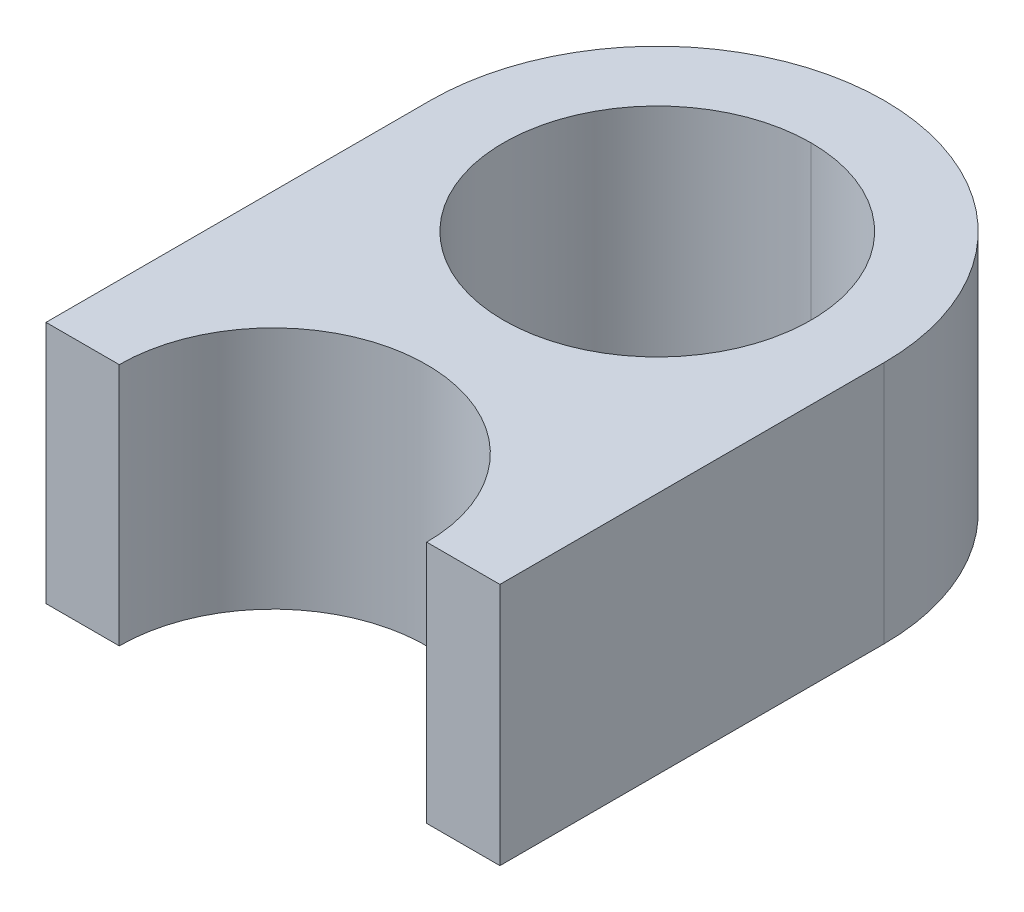
ISO-10303-21;
HEADER;
FILE_DESCRIPTION(('STEP AP214'),'2;1');
FILE_NAME('part.step','',(''),(''),'','','');
FILE_SCHEMA(('AUTOMOTIVE_DESIGN { 1 0 10303 214 1 1 1 1 }'));
ENDSEC;
DATA;
#1=APPLICATION_CONTEXT('core data for automotive mechanical design processes');
#2=APPLICATION_PROTOCOL_DEFINITION('international standard','automotive_design',2000,#1);
#3=PRODUCT_CONTEXT('',#1,'mechanical');
#4=PRODUCT('Part','Part','',(#3));
#5=PRODUCT_RELATED_PRODUCT_CATEGORY('part','',(#4));
#6=PRODUCT_DEFINITION_FORMATION('','',#4);
#7=PRODUCT_DEFINITION_CONTEXT('part definition',#1,'design');
#8=PRODUCT_DEFINITION('design','',#6,#7);
#9=PRODUCT_DEFINITION_SHAPE('','',#8);
#10=(LENGTH_UNIT() NAMED_UNIT(*) SI_UNIT(.MILLI.,.METRE.));
#11=(NAMED_UNIT(*) PLANE_ANGLE_UNIT() SI_UNIT($,.RADIAN.));
#12=(NAMED_UNIT(*) SI_UNIT($,.STERADIAN.) SOLID_ANGLE_UNIT());
#13=UNCERTAINTY_MEASURE_WITH_UNIT(LENGTH_MEASURE(1.E-05),#10,'distance_accuracy_value','');
#14=(GEOMETRIC_REPRESENTATION_CONTEXT(3) GLOBAL_UNCERTAINTY_ASSIGNED_CONTEXT((#13)) GLOBAL_UNIT_ASSIGNED_CONTEXT((#10,
#11,#12)) REPRESENTATION_CONTEXT('',''));
#15=CARTESIAN_POINT('',(0.,0.,0.));
#16=DIRECTION('',(0.,0.,1.));
#17=DIRECTION('',(1.,0.,0.));
#18=AXIS2_PLACEMENT_3D('',#15,#16,#17);
#19=CARTESIAN_POINT('',(-17.78,2.5,7.62));
#20=DIRECTION('',(0.,1.,0.));
#21=DIRECTION('',(0.,0.,1.));
#22=AXIS2_PLACEMENT_3D('',#19,#20,#21);
#23=CYLINDRICAL_SURFACE('',#22,0.508);
#24=CARTESIAN_POINT('',(-17.78,2.5,7.62));
#25=DIRECTION('',(0.,1.,0.));
#26=DIRECTION('',(0.,0.,1.));
#27=AXIS2_PLACEMENT_3D('',#24,#25,#26);
#28=CIRCLE('',#27,0.508);
#29=CARTESIAN_POINT('',(-17.78,2.5,7.112));
#30=VERTEX_POINT('',#29);
#31=CARTESIAN_POINT('',(-17.78,2.5,8.128));
#32=VERTEX_POINT('',#31);
#33=EDGE_CURVE('E11',#30,#32,#28,.T.);
#34=ORIENTED_EDGE('',*,*,#33,.F.);
#35=DIRECTION('',(0.,1.,0.));
#36=VECTOR('',#35,1.);
#37=CARTESIAN_POINT('',(-17.78,2.5,7.112));
#38=LINE('',#37,#36);
#39=CARTESIAN_POINT('',(-17.78,3.305,7.112));
#40=VERTEX_POINT('',#39);
#41=EDGE_CURVE('E24',#30,#40,#38,.T.);
#42=ORIENTED_EDGE('',*,*,#41,.T.);
#43=CARTESIAN_POINT('',(-17.78,3.305,7.62));
#44=DIRECTION('',(0.,-1.,0.));
#45=DIRECTION('',(0.,0.,1.));
#46=AXIS2_PLACEMENT_3D('',#43,#44,#45);
#47=CIRCLE('',#46,0.508);
#48=CARTESIAN_POINT('',(-17.78,3.305,8.128));
#49=VERTEX_POINT('',#48);
#50=EDGE_CURVE('E147',#49,#40,#47,.T.);
#51=ORIENTED_EDGE('',*,*,#50,.F.);
#52=DIRECTION('',(0.,1.,0.));
#53=VECTOR('',#52,1.);
#54=CARTESIAN_POINT('',(-17.78,2.5,8.128));
#55=LINE('',#54,#53);
#56=EDGE_CURVE('E37',#32,#49,#55,.T.);
#57=ORIENTED_EDGE('',*,*,#56,.F.);
#58=EDGE_LOOP('',(#34,#42,#51,#57));
#59=FACE_BOUND('',#58,.T.);
#60=ADVANCED_FACE('F17',(#59),#23,.F.);
#61=CARTESIAN_POINT('',(-17.78,2.5,7.62));
#62=DIRECTION('',(0.,1.,0.));
#63=DIRECTION('',(0.,0.,1.));
#64=AXIS2_PLACEMENT_3D('',#61,#62,#63);
#65=CYLINDRICAL_SURFACE('',#64,0.508);
#66=ORIENTED_EDGE('',*,*,#41,.F.);
#67=CARTESIAN_POINT('',(-17.78,2.5,7.62));
#68=DIRECTION('',(0.,1.,0.));
#69=DIRECTION('',(0.,0.,1.));
#70=AXIS2_PLACEMENT_3D('',#67,#68,#69);
#71=CIRCLE('',#70,0.508);
#72=EDGE_CURVE('E143',#32,#30,#71,.T.);
#73=ORIENTED_EDGE('',*,*,#72,.F.);
#74=ORIENTED_EDGE('',*,*,#56,.T.);
#75=CARTESIAN_POINT('',(-17.78,3.305,7.62));
#76=DIRECTION('',(0.,-1.,0.));
#77=DIRECTION('',(0.,0.,1.));
#78=AXIS2_PLACEMENT_3D('',#75,#76,#77);
#79=CIRCLE('',#78,0.508);
#80=EDGE_CURVE('E140',#40,#49,#79,.T.);
#81=ORIENTED_EDGE('',*,*,#80,.F.);
#82=EDGE_LOOP('',(#66,#73,#74,#81));
#83=FACE_BOUND('',#82,.T.);
#84=ADVANCED_FACE('F148',(#83),#65,.F.);
#85=CARTESIAN_POINT('',(-17.78,3.305,7.62));
#86=DIRECTION('',(0.,-1.,0.));
#87=DIRECTION('',(0.,0.,-1.));
#88=AXIS2_PLACEMENT_3D('',#85,#86,#87);
#89=PLANE('',#88);
#90=DIRECTION('',(0.,0.,-1.));
#91=VECTOR('',#90,1.);
#92=CARTESIAN_POINT('',(-18.53,3.305,7.62));
#93=LINE('',#92,#91);
#94=CARTESIAN_POINT('',(-18.53,3.305,8.89));
#95=VERTEX_POINT('',#94);
#96=CARTESIAN_POINT('',(-18.53,3.305,7.62));
#97=VERTEX_POINT('',#96);
#98=EDGE_CURVE('E138',#95,#97,#93,.T.);
#99=ORIENTED_EDGE('',*,*,#98,.F.);
#100=DIRECTION('',(-1.,0.,0.));
#101=VECTOR('',#100,1.);
#102=CARTESIAN_POINT('',(-17.78,3.305,8.89));
#103=LINE('',#102,#101);
#104=CARTESIAN_POINT('',(-18.288,3.305,8.89));
#105=VERTEX_POINT('',#104);
#106=EDGE_CURVE('E135',#105,#95,#103,.T.);
#107=ORIENTED_EDGE('',*,*,#106,.F.);
#108=CARTESIAN_POINT('',(-17.78,3.305,8.89));
#109=DIRECTION('',(0.,1.,0.));
#110=DIRECTION('',(0.,0.,1.));
#111=AXIS2_PLACEMENT_3D('',#108,#109,#110);
#112=CIRCLE('',#111,0.508);
#113=CARTESIAN_POINT('',(-17.272,3.305,8.89));
#114=VERTEX_POINT('',#113);
#115=EDGE_CURVE('E133',#114,#105,#112,.T.);
#116=ORIENTED_EDGE('',*,*,#115,.F.);
#117=DIRECTION('',(-1.,0.,0.));
#118=VECTOR('',#117,1.);
#119=CARTESIAN_POINT('',(-17.78,3.305,8.89));
#120=LINE('',#119,#118);
#121=CARTESIAN_POINT('',(-17.03,3.305,8.89));
#122=VERTEX_POINT('',#121);
#123=EDGE_CURVE('E105',#122,#114,#120,.T.);
#124=ORIENTED_EDGE('',*,*,#123,.F.);
#125=DIRECTION('',(0.,0.,1.));
#126=VECTOR('',#125,1.);
#127=CARTESIAN_POINT('',(-17.03,3.305,7.62));
#128=LINE('',#127,#126);
#129=CARTESIAN_POINT('',(-17.03,3.305,7.62));
#130=VERTEX_POINT('',#129);
#131=EDGE_CURVE('E129',#130,#122,#128,.T.);
#132=ORIENTED_EDGE('',*,*,#131,.F.);
#133=CARTESIAN_POINT('',(-17.78,3.305,7.62));
#134=DIRECTION('',(0.,-1.,0.));
#135=DIRECTION('',(0.,0.,1.));
#136=AXIS2_PLACEMENT_3D('',#133,#134,#135);
#137=CIRCLE('',#136,0.750000000000001);
#138=EDGE_CURVE('E126',#97,#130,#137,.T.);
#139=ORIENTED_EDGE('',*,*,#138,.F.);
#140=EDGE_LOOP('',(#99,#107,#116,#124,#132,#139));
#141=FACE_BOUND('',#140,.T.);
#142=ORIENTED_EDGE('',*,*,#50,.T.);
#143=ORIENTED_EDGE('',*,*,#80,.T.);
#144=EDGE_LOOP('',(#142,#143));
#145=FACE_BOUND('',#144,.T.);
#146=ADVANCED_FACE('F150',(#141,#145),#89,.F.);
#147=CARTESIAN_POINT('',(-17.78,2.5,7.62));
#148=DIRECTION('',(0.,-1.,0.));
#149=DIRECTION('',(0.,0.,-1.));
#150=AXIS2_PLACEMENT_3D('',#147,#148,#149);
#151=PLANE('',#150);
#152=DIRECTION('',(-1.,0.,0.));
#153=VECTOR('',#152,1.);
#154=CARTESIAN_POINT('',(-17.78,2.5,8.89));
#155=LINE('',#154,#153);
#156=CARTESIAN_POINT('',(-18.288,2.5,8.89));
#157=VERTEX_POINT('',#156);
#158=CARTESIAN_POINT('',(-18.53,2.5,8.89));
#159=VERTEX_POINT('',#158);
#160=EDGE_CURVE('E124',#157,#159,#155,.T.);
#161=ORIENTED_EDGE('',*,*,#160,.T.);
#162=DIRECTION('',(0.,0.,-1.));
#163=VECTOR('',#162,1.);
#164=CARTESIAN_POINT('',(-18.53,2.5,7.62));
#165=LINE('',#164,#163);
#166=CARTESIAN_POINT('',(-18.53,2.5,7.62));
#167=VERTEX_POINT('',#166);
#168=EDGE_CURVE('E122',#159,#167,#165,.T.);
#169=ORIENTED_EDGE('',*,*,#168,.T.);
#170=CARTESIAN_POINT('',(-17.78,2.5,7.62));
#171=DIRECTION('',(0.,-1.,0.));
#172=DIRECTION('',(0.,0.,1.));
#173=AXIS2_PLACEMENT_3D('',#170,#171,#172);
#174=CIRCLE('',#173,0.750000000000001);
#175=CARTESIAN_POINT('',(-17.03,2.5,7.62));
#176=VERTEX_POINT('',#175);
#177=EDGE_CURVE('E120',#167,#176,#174,.T.);
#178=ORIENTED_EDGE('',*,*,#177,.T.);
#179=DIRECTION('',(0.,0.,1.));
#180=VECTOR('',#179,1.);
#181=CARTESIAN_POINT('',(-17.03,2.5,7.62));
#182=LINE('',#181,#180);
#183=CARTESIAN_POINT('',(-17.03,2.5,8.89));
#184=VERTEX_POINT('',#183);
#185=EDGE_CURVE('E88',#176,#184,#182,.T.);
#186=ORIENTED_EDGE('',*,*,#185,.T.);
#187=DIRECTION('',(-1.,0.,0.));
#188=VECTOR('',#187,1.);
#189=CARTESIAN_POINT('',(-17.78,2.5,8.89));
#190=LINE('',#189,#188);
#191=CARTESIAN_POINT('',(-17.272,2.5,8.89));
#192=VERTEX_POINT('',#191);
#193=EDGE_CURVE('E81',#184,#192,#190,.T.);
#194=ORIENTED_EDGE('',*,*,#193,.T.);
#195=CARTESIAN_POINT('',(-17.78,2.5,8.89));
#196=DIRECTION('',(0.,1.,0.));
#197=DIRECTION('',(0.,0.,1.));
#198=AXIS2_PLACEMENT_3D('',#195,#196,#197);
#199=CIRCLE('',#198,0.508);
#200=EDGE_CURVE('E85',#192,#157,#199,.T.);
#201=ORIENTED_EDGE('',*,*,#200,.T.);
#202=EDGE_LOOP('',(#161,#169,#178,#186,#194,#201));
#203=FACE_BOUND('',#202,.T.);
#204=ORIENTED_EDGE('',*,*,#72,.T.);
#205=ORIENTED_EDGE('',*,*,#33,.T.);
#206=EDGE_LOOP('',(#204,#205));
#207=FACE_BOUND('',#206,.T.);
#208=ADVANCED_FACE('F83',(#203,#207),#151,.T.);
#209=CARTESIAN_POINT('',(-17.78,2.5,7.62));
#210=DIRECTION('',(0.,1.,0.));
#211=DIRECTION('',(0.,0.,1.));
#212=AXIS2_PLACEMENT_3D('',#209,#210,#211);
#213=CYLINDRICAL_SURFACE('',#212,0.750000000000001);
#214=ORIENTED_EDGE('',*,*,#177,.F.);
#215=DIRECTION('',(0.,1.,0.));
#216=VECTOR('',#215,1.);
#217=CARTESIAN_POINT('',(-18.53,2.5,7.62));
#218=LINE('',#217,#216);
#219=EDGE_CURVE('E101',#167,#97,#218,.T.);
#220=ORIENTED_EDGE('',*,*,#219,.T.);
#221=ORIENTED_EDGE('',*,*,#138,.T.);
#222=DIRECTION('',(0.,-1.,0.));
#223=VECTOR('',#222,1.);
#224=CARTESIAN_POINT('',(-17.03,2.5,7.62));
#225=LINE('',#224,#223);
#226=EDGE_CURVE('E114',#130,#176,#225,.T.);
#227=ORIENTED_EDGE('',*,*,#226,.T.);
#228=EDGE_LOOP('',(#214,#220,#221,#227));
#229=FACE_BOUND('',#228,.T.);
#230=ADVANCED_FACE('F159',(#229),#213,.T.);
#231=CARTESIAN_POINT('',(-18.53,2.5,8.89));
#232=DIRECTION('',(-1.,0.,0.));
#233=DIRECTION('',(0.,0.,1.));
#234=AXIS2_PLACEMENT_3D('',#231,#232,#233);
#235=PLANE('',#234);
#236=ORIENTED_EDGE('',*,*,#168,.F.);
#237=DIRECTION('',(0.,1.,0.));
#238=VECTOR('',#237,1.);
#239=CARTESIAN_POINT('',(-18.53,2.5,8.89));
#240=LINE('',#239,#238);
#241=EDGE_CURVE('E108',#159,#95,#240,.T.);
#242=ORIENTED_EDGE('',*,*,#241,.T.);
#243=ORIENTED_EDGE('',*,*,#98,.T.);
#244=ORIENTED_EDGE('',*,*,#219,.F.);
#245=EDGE_LOOP('',(#236,#242,#243,#244));
#246=FACE_BOUND('',#245,.T.);
#247=ADVANCED_FACE('F192',(#246),#235,.T.);
#248=CARTESIAN_POINT('',(-18.288,2.5,8.89));
#249=DIRECTION('',(0.,0.,1.));
#250=DIRECTION('',(1.,-1.86375249485112E-13,0.));
#251=AXIS2_PLACEMENT_3D('',#248,#249,#250);
#252=PLANE('',#251);
#253=ORIENTED_EDGE('',*,*,#160,.F.);
#254=DIRECTION('',(0.,1.,0.));
#255=VECTOR('',#254,1.);
#256=CARTESIAN_POINT('',(-18.288,2.5,8.89));
#257=LINE('',#256,#255);
#258=EDGE_CURVE('E100',#157,#105,#257,.T.);
#259=ORIENTED_EDGE('',*,*,#258,.T.);
#260=ORIENTED_EDGE('',*,*,#106,.T.);
#261=ORIENTED_EDGE('',*,*,#241,.F.);
#262=EDGE_LOOP('',(#253,#259,#260,#261));
#263=FACE_BOUND('',#262,.T.);
#264=ADVANCED_FACE('F202',(#263),#252,.T.);
#265=CARTESIAN_POINT('',(-17.78,2.5,8.89));
#266=DIRECTION('',(0.,1.,0.));
#267=DIRECTION('',(0.,0.,1.));
#268=AXIS2_PLACEMENT_3D('',#265,#266,#267);
#269=CYLINDRICAL_SURFACE('',#268,0.508);
#270=ORIENTED_EDGE('',*,*,#258,.F.);
#271=ORIENTED_EDGE('',*,*,#200,.F.);
#272=DIRECTION('',(0.,-1.,0.));
#273=VECTOR('',#272,1.);
#274=CARTESIAN_POINT('',(-17.272,2.5,8.89));
#275=LINE('',#274,#273);
#276=EDGE_CURVE('E98',#114,#192,#275,.T.);
#277=ORIENTED_EDGE('',*,*,#276,.F.);
#278=ORIENTED_EDGE('',*,*,#115,.T.);
#279=EDGE_LOOP('',(#270,#271,#277,#278));
#280=FACE_BOUND('',#279,.T.);
#281=ADVANCED_FACE('F96',(#280),#269,.F.);
#282=CARTESIAN_POINT('',(-17.272,2.5,8.89));
#283=DIRECTION('',(0.,0.,1.));
#284=DIRECTION('',(1.,2.65226316574968E-13,0.));
#285=AXIS2_PLACEMENT_3D('',#282,#283,#284);
#286=PLANE('',#285);
#287=ORIENTED_EDGE('',*,*,#193,.F.);
#288=DIRECTION('',(0.,1.,0.));
#289=VECTOR('',#288,1.);
#290=CARTESIAN_POINT('',(-17.03,2.5,8.89));
#291=LINE('',#290,#289);
#292=EDGE_CURVE('E106',#184,#122,#291,.T.);
#293=ORIENTED_EDGE('',*,*,#292,.T.);
#294=ORIENTED_EDGE('',*,*,#123,.T.);
#295=ORIENTED_EDGE('',*,*,#276,.T.);
#296=EDGE_LOOP('',(#287,#293,#294,#295));
#297=FACE_BOUND('',#296,.T.);
#298=ADVANCED_FACE('F104',(#297),#286,.T.);
#299=CARTESIAN_POINT('',(-17.03,2.5,8.89));
#300=DIRECTION('',(1.,0.,0.));
#301=DIRECTION('',(0.,1.,0.));
#302=AXIS2_PLACEMENT_3D('',#299,#300,#301);
#303=PLANE('',#302);
#304=ORIENTED_EDGE('',*,*,#185,.F.);
#305=ORIENTED_EDGE('',*,*,#226,.F.);
#306=ORIENTED_EDGE('',*,*,#131,.T.);
#307=ORIENTED_EDGE('',*,*,#292,.F.);
#308=EDGE_LOOP('',(#304,#305,#306,#307));
#309=FACE_BOUND('',#308,.T.);
#310=ADVANCED_FACE('F229',(#309),#303,.T.);
#311=CLOSED_SHELL('',(#60,#84,#146,#208,#230,#247,#264,#281,#298,#310));
#312=MANIFOLD_SOLID_BREP('B1',#311);
#313=ADVANCED_BREP_SHAPE_REPRESENTATION('',(#18,#312),#14);
#314=SHAPE_DEFINITION_REPRESENTATION(#9,#313);
ENDSEC;
END-ISO-10303-21;
